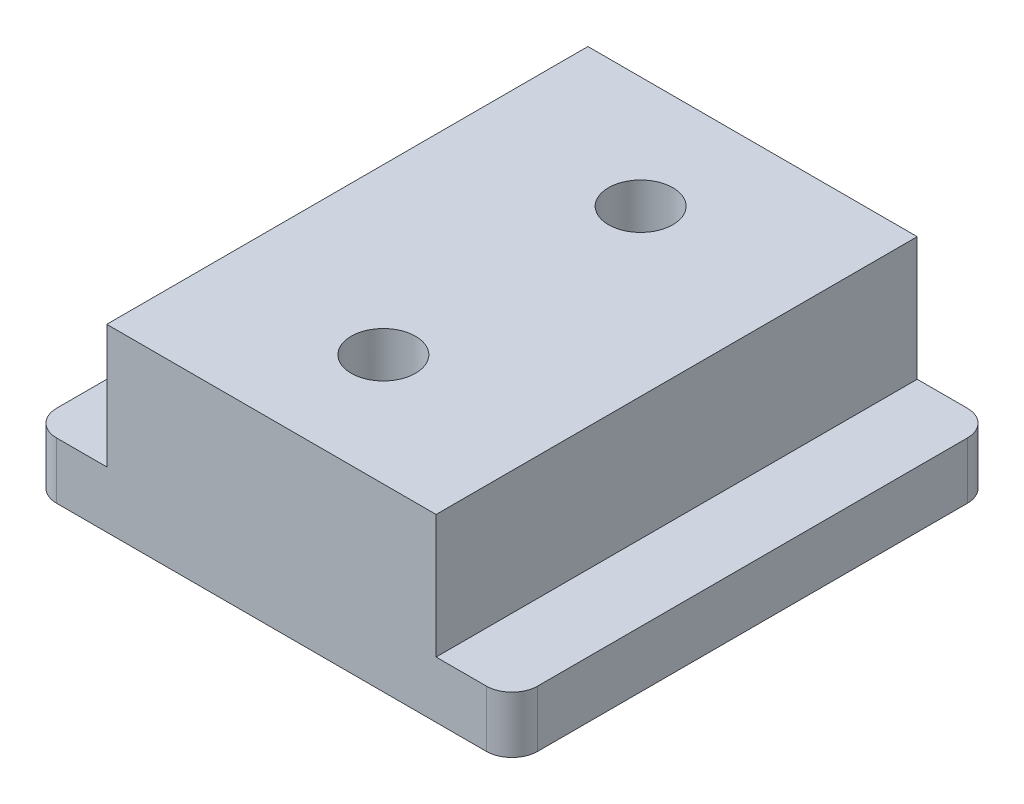
ISO-10303-21;
HEADER;
FILE_DESCRIPTION(('STEP AP214'),'2;1');
FILE_NAME('part.step','',(''),(''),'','','');
FILE_SCHEMA(('AUTOMOTIVE_DESIGN { 1 0 10303 214 1 1 1 1 }'));
ENDSEC;
DATA;
#1=APPLICATION_CONTEXT('core data for automotive mechanical design processes');
#2=APPLICATION_PROTOCOL_DEFINITION('international standard','automotive_design',2000,#1);
#3=PRODUCT_CONTEXT('',#1,'mechanical');
#4=PRODUCT('Part','Part','',(#3));
#5=PRODUCT_RELATED_PRODUCT_CATEGORY('part','',(#4));
#6=PRODUCT_DEFINITION_FORMATION('','',#4);
#7=PRODUCT_DEFINITION_CONTEXT('part definition',#1,'design');
#8=PRODUCT_DEFINITION('design','',#6,#7);
#9=PRODUCT_DEFINITION_SHAPE('','',#8);
#10=(LENGTH_UNIT() NAMED_UNIT(*) SI_UNIT(.MILLI.,.METRE.));
#11=(NAMED_UNIT(*) PLANE_ANGLE_UNIT() SI_UNIT($,.RADIAN.));
#12=(NAMED_UNIT(*) SI_UNIT($,.STERADIAN.) SOLID_ANGLE_UNIT());
#13=UNCERTAINTY_MEASURE_WITH_UNIT(LENGTH_MEASURE(1.E-05),#10,'distance_accuracy_value','');
#14=(GEOMETRIC_REPRESENTATION_CONTEXT(3) GLOBAL_UNCERTAINTY_ASSIGNED_CONTEXT((#13)) GLOBAL_UNIT_ASSIGNED_CONTEXT((#10,
#11,#12)) REPRESENTATION_CONTEXT('',''));
#15=CARTESIAN_POINT('',(0.,0.,0.));
#16=DIRECTION('',(0.,0.,1.));
#17=DIRECTION('',(1.,0.,0.));
#18=AXIS2_PLACEMENT_3D('',#15,#16,#17);
#19=CARTESIAN_POINT('',(-8.35,2.2,-8.35));
#20=DIRECTION('',(0.,-1.,0.));
#21=DIRECTION('',(0.,0.,-1.));
#22=AXIS2_PLACEMENT_3D('',#19,#20,#21);
#23=CYLINDRICAL_SURFACE('',#22,1.);
#24=CARTESIAN_POINT('',(-8.35,0.,-8.35));
#25=DIRECTION('',(0.,1.,0.));
#26=DIRECTION('',(0.,0.,1.));
#27=AXIS2_PLACEMENT_3D('',#24,#25,#26);
#28=CIRCLE('',#27,1.);
#29=CARTESIAN_POINT('',(-9.35,0.,-8.35));
#30=VERTEX_POINT('',#29);
#31=CARTESIAN_POINT('',(-8.34999999999999,0.,-9.35));
#32=VERTEX_POINT('',#31);
#33=EDGE_CURVE('E130',#30,#32,#28,.F.);
#34=ORIENTED_EDGE('',*,*,#33,.F.);
#35=DIRECTION('',(0.,-1.,0.));
#36=VECTOR('',#35,1.);
#37=CARTESIAN_POINT('',(-9.35,2.2,-8.35));
#38=LINE('',#37,#36);
#39=CARTESIAN_POINT('',(-9.35,2.2,-8.35));
#40=VERTEX_POINT('',#39);
#41=EDGE_CURVE('E86',#40,#30,#38,.T.);
#42=ORIENTED_EDGE('',*,*,#41,.F.);
#43=CARTESIAN_POINT('',(-8.35,2.2,-8.35));
#44=DIRECTION('',(0.,1.,0.));
#45=DIRECTION('',(0.,0.,1.));
#46=AXIS2_PLACEMENT_3D('',#43,#44,#45);
#47=CIRCLE('',#46,1.);
#48=CARTESIAN_POINT('',(-8.34999999999999,2.2,-9.35));
#49=VERTEX_POINT('',#48);
#50=EDGE_CURVE('E124',#40,#49,#47,.F.);
#51=ORIENTED_EDGE('',*,*,#50,.T.);
#52=DIRECTION('',(0.,-1.,0.));
#53=VECTOR('',#52,1.);
#54=CARTESIAN_POINT('',(-8.34999999999999,2.2,-9.35));
#55=LINE('',#54,#53);
#56=EDGE_CURVE('E62',#49,#32,#55,.T.);
#57=ORIENTED_EDGE('',*,*,#56,.T.);
#58=EDGE_LOOP('',(#34,#42,#51,#57));
#59=FACE_BOUND('',#58,.T.);
#60=ADVANCED_FACE('F38',(#59),#23,.T.);
#61=CARTESIAN_POINT('',(-9.35,2.2,0.));
#62=DIRECTION('',(1.,0.,0.));
#63=DIRECTION('',(0.,0.,-1.));
#64=AXIS2_PLACEMENT_3D('',#61,#62,#63);
#65=PLANE('',#64);
#66=DIRECTION('',(0.,0.,1.));
#67=VECTOR('',#66,1.);
#68=CARTESIAN_POINT('',(-9.35,0.,0.));
#69=LINE('',#68,#67);
#70=CARTESIAN_POINT('',(-9.35,0.,8.34999999999999));
#71=VERTEX_POINT('',#70);
#72=EDGE_CURVE('E226',#30,#71,#69,.T.);
#73=ORIENTED_EDGE('',*,*,#72,.T.);
#74=DIRECTION('',(0.,-1.,0.));
#75=VECTOR('',#74,1.);
#76=CARTESIAN_POINT('',(-9.35,2.2,8.34999999999999));
#77=LINE('',#76,#75);
#78=CARTESIAN_POINT('',(-9.35,2.2,8.34999999999999));
#79=VERTEX_POINT('',#78);
#80=EDGE_CURVE('E106',#79,#71,#77,.T.);
#81=ORIENTED_EDGE('',*,*,#80,.F.);
#82=DIRECTION('',(0.,0.,1.));
#83=VECTOR('',#82,1.);
#84=CARTESIAN_POINT('',(-9.35,2.2,0.));
#85=LINE('',#84,#83);
#86=EDGE_CURVE('E121',#40,#79,#85,.T.);
#87=ORIENTED_EDGE('',*,*,#86,.F.);
#88=ORIENTED_EDGE('',*,*,#41,.T.);
#89=EDGE_LOOP('',(#73,#81,#87,#88));
#90=FACE_BOUND('',#89,.T.);
#91=ADVANCED_FACE('F306',(#90),#65,.F.);
#92=CARTESIAN_POINT('',(-8.35,2.2,8.34999999999999));
#93=DIRECTION('',(0.,-1.,0.));
#94=DIRECTION('',(0.,0.,-1.));
#95=AXIS2_PLACEMENT_3D('',#92,#93,#94);
#96=CYLINDRICAL_SURFACE('',#95,1.);
#97=CARTESIAN_POINT('',(-8.35,0.,8.34999999999999));
#98=DIRECTION('',(0.,1.,0.));
#99=DIRECTION('',(0.,0.,1.));
#100=AXIS2_PLACEMENT_3D('',#97,#98,#99);
#101=CIRCLE('',#100,1.);
#102=CARTESIAN_POINT('',(-8.34999999999999,0.,9.34999999999999));
#103=VERTEX_POINT('',#102);
#104=EDGE_CURVE('E102',#103,#71,#101,.F.);
#105=ORIENTED_EDGE('',*,*,#104,.F.);
#106=DIRECTION('',(0.,-1.,0.));
#107=VECTOR('',#106,1.);
#108=CARTESIAN_POINT('',(-8.34999999999999,2.2,9.34999999999999));
#109=LINE('',#108,#107);
#110=CARTESIAN_POINT('',(-8.34999999999999,2.2,9.34999999999999));
#111=VERTEX_POINT('',#110);
#112=EDGE_CURVE('E96',#111,#103,#109,.T.);
#113=ORIENTED_EDGE('',*,*,#112,.F.);
#114=CARTESIAN_POINT('',(-8.35,2.2,8.34999999999999));
#115=DIRECTION('',(0.,1.,0.));
#116=DIRECTION('',(0.,0.,1.));
#117=AXIS2_PLACEMENT_3D('',#114,#115,#116);
#118=CIRCLE('',#117,1.);
#119=EDGE_CURVE('E100',#111,#79,#118,.F.);
#120=ORIENTED_EDGE('',*,*,#119,.T.);
#121=ORIENTED_EDGE('',*,*,#80,.T.);
#122=EDGE_LOOP('',(#105,#113,#120,#121));
#123=FACE_BOUND('',#122,.T.);
#124=ADVANCED_FACE('F98',(#123),#96,.T.);
#125=CARTESIAN_POINT('',(0.,2.2,9.34999999999999));
#126=DIRECTION('',(0.,0.,-1.));
#127=DIRECTION('',(-1.,0.,0.));
#128=AXIS2_PLACEMENT_3D('',#125,#126,#127);
#129=PLANE('',#128);
#130=DIRECTION('',(1.,0.,0.));
#131=VECTOR('',#130,1.);
#132=CARTESIAN_POINT('',(0.,0.,9.34999999999999));
#133=LINE('',#132,#131);
#134=CARTESIAN_POINT('',(8.34999999999999,0.,9.34999999999999));
#135=VERTEX_POINT('',#134);
#136=EDGE_CURVE('E224',#103,#135,#133,.T.);
#137=ORIENTED_EDGE('',*,*,#136,.T.);
#138=DIRECTION('',(0.,-1.,0.));
#139=VECTOR('',#138,1.);
#140=CARTESIAN_POINT('',(8.34999999999999,2.2,9.34999999999999));
#141=LINE('',#140,#139);
#142=CARTESIAN_POINT('',(8.34999999999999,2.2,9.34999999999999));
#143=VERTEX_POINT('',#142);
#144=EDGE_CURVE('E185',#143,#135,#141,.T.);
#145=ORIENTED_EDGE('',*,*,#144,.F.);
#146=DIRECTION('',(1.,0.,0.));
#147=VECTOR('',#146,1.);
#148=CARTESIAN_POINT('',(0.,2.2,9.34999999999999));
#149=LINE('',#148,#147);
#150=CARTESIAN_POINT('',(6.4,2.2,9.34999999999999));
#151=VERTEX_POINT('',#150);
#152=EDGE_CURVE('E188',#151,#143,#149,.T.);
#153=ORIENTED_EDGE('',*,*,#152,.F.);
#154=DIRECTION('',(0.,-1.,0.));
#155=VECTOR('',#154,1.);
#156=CARTESIAN_POINT('',(6.4,7.,9.34999999999999));
#157=LINE('',#156,#155);
#158=CARTESIAN_POINT('',(6.4,7.,9.34999999999999));
#159=VERTEX_POINT('',#158);
#160=EDGE_CURVE('E146',#159,#151,#157,.T.);
#161=ORIENTED_EDGE('',*,*,#160,.F.);
#162=DIRECTION('',(1.,0.,0.));
#163=VECTOR('',#162,1.);
#164=CARTESIAN_POINT('',(0.,7.,9.34999999999999));
#165=LINE('',#164,#163);
#166=CARTESIAN_POINT('',(-6.4,7.,9.34999999999999));
#167=VERTEX_POINT('',#166);
#168=EDGE_CURVE('E164',#167,#159,#165,.T.);
#169=ORIENTED_EDGE('',*,*,#168,.F.);
#170=DIRECTION('',(0.,-1.,0.));
#171=VECTOR('',#170,1.);
#172=CARTESIAN_POINT('',(-6.4,7.,9.34999999999999));
#173=LINE('',#172,#171);
#174=CARTESIAN_POINT('',(-6.4,2.2,9.34999999999999));
#175=VERTEX_POINT('',#174);
#176=EDGE_CURVE('E114',#167,#175,#173,.T.);
#177=ORIENTED_EDGE('',*,*,#176,.T.);
#178=DIRECTION('',(1.,0.,0.));
#179=VECTOR('',#178,1.);
#180=CARTESIAN_POINT('',(0.,2.2,9.34999999999999));
#181=LINE('',#180,#179);
#182=EDGE_CURVE('E110',#111,#175,#181,.T.);
#183=ORIENTED_EDGE('',*,*,#182,.F.);
#184=ORIENTED_EDGE('',*,*,#112,.T.);
#185=EDGE_LOOP('',(#137,#145,#153,#161,#169,#177,#183,#184));
#186=FACE_BOUND('',#185,.T.);
#187=ADVANCED_FACE('F111',(#186),#129,.F.);
#188=CARTESIAN_POINT('',(0.,2.2,-9.35));
#189=DIRECTION('',(0.,0.,-1.));
#190=DIRECTION('',(-1.,0.,0.));
#191=AXIS2_PLACEMENT_3D('',#188,#189,#190);
#192=PLANE('',#191);
#193=DIRECTION('',(1.,0.,0.));
#194=VECTOR('',#193,1.);
#195=CARTESIAN_POINT('',(0.,0.,-9.35));
#196=LINE('',#195,#194);
#197=CARTESIAN_POINT('',(8.34999999999999,0.,-9.35));
#198=VERTEX_POINT('',#197);
#199=EDGE_CURVE('E221',#32,#198,#196,.T.);
#200=ORIENTED_EDGE('',*,*,#199,.F.);
#201=ORIENTED_EDGE('',*,*,#56,.F.);
#202=DIRECTION('',(1.,0.,0.));
#203=VECTOR('',#202,1.);
#204=CARTESIAN_POINT('',(0.,2.2,-9.35));
#205=LINE('',#204,#203);
#206=CARTESIAN_POINT('',(-6.4,2.2,-9.35));
#207=VERTEX_POINT('',#206);
#208=EDGE_CURVE('E134',#49,#207,#205,.T.);
#209=ORIENTED_EDGE('',*,*,#208,.T.);
#210=DIRECTION('',(0.,-1.,0.));
#211=VECTOR('',#210,1.);
#212=CARTESIAN_POINT('',(-6.4,7.,-9.35));
#213=LINE('',#212,#211);
#214=CARTESIAN_POINT('',(-6.4,7.,-9.35));
#215=VERTEX_POINT('',#214);
#216=EDGE_CURVE('E145',#215,#207,#213,.T.);
#217=ORIENTED_EDGE('',*,*,#216,.F.);
#218=DIRECTION('',(1.,0.,0.));
#219=VECTOR('',#218,1.);
#220=CARTESIAN_POINT('',(0.,7.,-9.35));
#221=LINE('',#220,#219);
#222=CARTESIAN_POINT('',(6.4,7.,-9.35));
#223=VERTEX_POINT('',#222);
#224=EDGE_CURVE('E170',#215,#223,#221,.T.);
#225=ORIENTED_EDGE('',*,*,#224,.T.);
#226=DIRECTION('',(0.,-1.,0.));
#227=VECTOR('',#226,1.);
#228=CARTESIAN_POINT('',(6.4,7.,-9.35));
#229=LINE('',#228,#227);
#230=CARTESIAN_POINT('',(6.4,2.2,-9.35));
#231=VERTEX_POINT('',#230);
#232=EDGE_CURVE('E142',#223,#231,#229,.T.);
#233=ORIENTED_EDGE('',*,*,#232,.T.);
#234=DIRECTION('',(1.,0.,0.));
#235=VECTOR('',#234,1.);
#236=CARTESIAN_POINT('',(0.,2.2,-9.35));
#237=LINE('',#236,#235);
#238=CARTESIAN_POINT('',(8.34999999999999,2.2,-9.35));
#239=VERTEX_POINT('',#238);
#240=EDGE_CURVE('E205',#231,#239,#237,.T.);
#241=ORIENTED_EDGE('',*,*,#240,.T.);
#242=DIRECTION('',(0.,-1.,0.));
#243=VECTOR('',#242,1.);
#244=CARTESIAN_POINT('',(8.34999999999999,2.2,-9.35));
#245=LINE('',#244,#243);
#246=EDGE_CURVE('E182',#239,#198,#245,.T.);
#247=ORIENTED_EDGE('',*,*,#246,.T.);
#248=EDGE_LOOP('',(#200,#201,#209,#217,#225,#233,#241,#247));
#249=FACE_BOUND('',#248,.T.);
#250=ADVANCED_FACE('F230',(#249),#192,.T.);
#251=CARTESIAN_POINT('',(0.,2.2,0.));
#252=DIRECTION('',(0.,1.,0.));
#253=DIRECTION('',(0.,0.,1.));
#254=AXIS2_PLACEMENT_3D('',#251,#252,#253);
#255=PLANE('',#254);
#256=ORIENTED_EDGE('',*,*,#50,.F.);
#257=ORIENTED_EDGE('',*,*,#86,.T.);
#258=ORIENTED_EDGE('',*,*,#119,.F.);
#259=ORIENTED_EDGE('',*,*,#182,.T.);
#260=DIRECTION('',(0.,0.,1.));
#261=VECTOR('',#260,1.);
#262=CARTESIAN_POINT('',(-6.4,2.2,0.));
#263=LINE('',#262,#261);
#264=EDGE_CURVE('E117',#207,#175,#263,.T.);
#265=ORIENTED_EDGE('',*,*,#264,.F.);
#266=ORIENTED_EDGE('',*,*,#208,.F.);
#267=EDGE_LOOP('',(#256,#257,#258,#259,#265,#266));
#268=FACE_BOUND('',#267,.T.);
#269=ADVANCED_FACE('F120',(#268),#255,.T.);
#270=CARTESIAN_POINT('',(0.,0.,0.));
#271=DIRECTION('',(0.,1.,0.));
#272=DIRECTION('',(0.,0.,1.));
#273=AXIS2_PLACEMENT_3D('',#270,#271,#272);
#274=PLANE('',#273);
#275=CARTESIAN_POINT('',(0.,0.,-5.));
#276=DIRECTION('',(0.,1.,0.));
#277=DIRECTION('',(0.,0.,1.));
#278=AXIS2_PLACEMENT_3D('',#275,#276,#277);
#279=CIRCLE('',#278,2.5);
#280=CARTESIAN_POINT('',(0.,0.,-2.5));
#281=VERTEX_POINT('',#280);
#282=EDGE_CURVE('E288',#281,#281,#279,.T.);
#283=ORIENTED_EDGE('',*,*,#282,.T.);
#284=EDGE_LOOP('',(#283));
#285=FACE_BOUND('',#284,.T.);
#286=CARTESIAN_POINT('',(0.,0.,5.));
#287=DIRECTION('',(0.,1.,0.));
#288=DIRECTION('',(0.,0.,1.));
#289=AXIS2_PLACEMENT_3D('',#286,#287,#288);
#290=CIRCLE('',#289,2.5);
#291=CARTESIAN_POINT('',(0.,0.,7.5));
#292=VERTEX_POINT('',#291);
#293=EDGE_CURVE('E282',#292,#292,#290,.T.);
#294=ORIENTED_EDGE('',*,*,#293,.T.);
#295=EDGE_LOOP('',(#294));
#296=FACE_BOUND('',#295,.T.);
#297=ORIENTED_EDGE('',*,*,#33,.T.);
#298=ORIENTED_EDGE('',*,*,#199,.T.);
#299=CARTESIAN_POINT('',(8.35,0.,-8.35));
#300=DIRECTION('',(0.,1.,0.));
#301=DIRECTION('',(0.,0.,1.));
#302=AXIS2_PLACEMENT_3D('',#299,#300,#301);
#303=CIRCLE('',#302,1.);
#304=CARTESIAN_POINT('',(9.35,0.,-8.35));
#305=VERTEX_POINT('',#304);
#306=EDGE_CURVE('E189',#198,#305,#303,.F.);
#307=ORIENTED_EDGE('',*,*,#306,.T.);
#308=DIRECTION('',(0.,0.,1.));
#309=VECTOR('',#308,1.);
#310=CARTESIAN_POINT('',(9.35,0.,0.));
#311=LINE('',#310,#309);
#312=CARTESIAN_POINT('',(9.35,0.,8.34999999999999));
#313=VERTEX_POINT('',#312);
#314=EDGE_CURVE('E193',#305,#313,#311,.T.);
#315=ORIENTED_EDGE('',*,*,#314,.T.);
#316=CARTESIAN_POINT('',(8.35,0.,8.34999999999999));
#317=DIRECTION('',(0.,1.,0.));
#318=DIRECTION('',(0.,0.,1.));
#319=AXIS2_PLACEMENT_3D('',#316,#317,#318);
#320=CIRCLE('',#319,1.);
#321=EDGE_CURVE('E196',#313,#135,#320,.F.);
#322=ORIENTED_EDGE('',*,*,#321,.T.);
#323=ORIENTED_EDGE('',*,*,#136,.F.);
#324=ORIENTED_EDGE('',*,*,#104,.T.);
#325=ORIENTED_EDGE('',*,*,#72,.F.);
#326=EDGE_LOOP('',(#297,#298,#307,#315,#322,#323,#324,#325));
#327=FACE_BOUND('',#326,.T.);
#328=ADVANCED_FACE('F228',(#285,#296,#327),#274,.F.);
#329=CARTESIAN_POINT('',(-6.4,7.,0.));
#330=DIRECTION('',(1.,0.,0.));
#331=DIRECTION('',(0.,0.,-1.));
#332=AXIS2_PLACEMENT_3D('',#329,#330,#331);
#333=PLANE('',#332);
#334=ORIENTED_EDGE('',*,*,#216,.T.);
#335=ORIENTED_EDGE('',*,*,#264,.T.);
#336=ORIENTED_EDGE('',*,*,#176,.F.);
#337=DIRECTION('',(0.,0.,1.));
#338=VECTOR('',#337,1.);
#339=CARTESIAN_POINT('',(-6.4,7.,0.));
#340=LINE('',#339,#338);
#341=EDGE_CURVE('E167',#215,#167,#340,.T.);
#342=ORIENTED_EDGE('',*,*,#341,.F.);
#343=EDGE_LOOP('',(#334,#335,#336,#342));
#344=FACE_BOUND('',#343,.T.);
#345=ADVANCED_FACE('F321',(#344),#333,.F.);
#346=CARTESIAN_POINT('',(6.4,7.,0.));
#347=DIRECTION('',(1.,0.,0.));
#348=DIRECTION('',(0.,0.,-1.));
#349=AXIS2_PLACEMENT_3D('',#346,#347,#348);
#350=PLANE('',#349);
#351=DIRECTION('',(0.,0.,1.));
#352=VECTOR('',#351,1.);
#353=CARTESIAN_POINT('',(6.4,2.2,0.));
#354=LINE('',#353,#352);
#355=EDGE_CURVE('E53',#231,#151,#354,.T.);
#356=ORIENTED_EDGE('',*,*,#355,.F.);
#357=ORIENTED_EDGE('',*,*,#232,.F.);
#358=DIRECTION('',(0.,0.,1.));
#359=VECTOR('',#358,1.);
#360=CARTESIAN_POINT('',(6.4,7.,0.));
#361=LINE('',#360,#359);
#362=EDGE_CURVE('E173',#223,#159,#361,.T.);
#363=ORIENTED_EDGE('',*,*,#362,.T.);
#364=ORIENTED_EDGE('',*,*,#160,.T.);
#365=EDGE_LOOP('',(#356,#357,#363,#364));
#366=FACE_BOUND('',#365,.T.);
#367=ADVANCED_FACE('F269',(#366),#350,.T.);
#368=CARTESIAN_POINT('',(0.,7.,-5.));
#369=DIRECTION('',(0.,-1.,0.));
#370=DIRECTION('',(0.,0.,-1.));
#371=AXIS2_PLACEMENT_3D('',#368,#369,#370);
#372=CYLINDRICAL_SURFACE('',#371,1.25);
#373=CARTESIAN_POINT('',(0.,4.05404962177392,-5.));
#374=DIRECTION('',(0.,-1.,0.));
#375=DIRECTION('',(0.,0.,-1.));
#376=AXIS2_PLACEMENT_3D('',#373,#374,#375);
#377=CIRCLE('',#376,1.25);
#378=CARTESIAN_POINT('',(0.,4.05404962177392,-6.25));
#379=VERTEX_POINT('',#378);
#380=EDGE_CURVE('E11',#379,#379,#377,.T.);
#381=ORIENTED_EDGE('',*,*,#380,.T.);
#382=EDGE_LOOP('',(#381));
#383=FACE_BOUND('',#382,.T.);
#384=CARTESIAN_POINT('',(0.,7.,-5.));
#385=DIRECTION('',(0.,1.,0.));
#386=DIRECTION('',(0.,0.,1.));
#387=AXIS2_PLACEMENT_3D('',#384,#385,#386);
#388=CIRCLE('',#387,1.25);
#389=CARTESIAN_POINT('',(0.,7.,-3.75));
#390=VERTEX_POINT('',#389);
#391=EDGE_CURVE('E161',#390,#390,#388,.T.);
#392=ORIENTED_EDGE('',*,*,#391,.T.);
#393=EDGE_LOOP('',(#392));
#394=FACE_BOUND('',#393,.T.);
#395=ADVANCED_FACE('F327',(#383,#394),#372,.F.);
#396=CARTESIAN_POINT('',(0.,7.,5.));
#397=DIRECTION('',(0.,-1.,0.));
#398=DIRECTION('',(0.,0.,-1.));
#399=AXIS2_PLACEMENT_3D('',#396,#397,#398);
#400=CYLINDRICAL_SURFACE('',#399,1.25);
#401=CARTESIAN_POINT('',(0.,4.05404962177392,5.));
#402=DIRECTION('',(0.,-1.,0.));
#403=DIRECTION('',(0.,0.,-1.));
#404=AXIS2_PLACEMENT_3D('',#401,#402,#403);
#405=CIRCLE('',#404,1.25);
#406=CARTESIAN_POINT('',(0.,4.05404962177392,3.75));
#407=VERTEX_POINT('',#406);
#408=EDGE_CURVE('E46',#407,#407,#405,.T.);
#409=ORIENTED_EDGE('',*,*,#408,.T.);
#410=EDGE_LOOP('',(#409));
#411=FACE_BOUND('',#410,.T.);
#412=CARTESIAN_POINT('',(0.,7.,5.));
#413=DIRECTION('',(0.,1.,0.));
#414=DIRECTION('',(0.,0.,1.));
#415=AXIS2_PLACEMENT_3D('',#412,#413,#414);
#416=CIRCLE('',#415,1.25);
#417=CARTESIAN_POINT('',(0.,7.,6.25));
#418=VERTEX_POINT('',#417);
#419=EDGE_CURVE('E158',#418,#418,#416,.T.);
#420=ORIENTED_EDGE('',*,*,#419,.T.);
#421=EDGE_LOOP('',(#420));
#422=FACE_BOUND('',#421,.T.);
#423=ADVANCED_FACE('F333',(#411,#422),#400,.F.);
#424=CARTESIAN_POINT('',(0.,7.,0.));
#425=DIRECTION('',(0.,1.,0.));
#426=DIRECTION('',(0.,0.,1.));
#427=AXIS2_PLACEMENT_3D('',#424,#425,#426);
#428=PLANE('',#427);
#429=ORIENTED_EDGE('',*,*,#362,.F.);
#430=ORIENTED_EDGE('',*,*,#224,.F.);
#431=ORIENTED_EDGE('',*,*,#341,.T.);
#432=ORIENTED_EDGE('',*,*,#168,.T.);
#433=EDGE_LOOP('',(#429,#430,#431,#432));
#434=FACE_BOUND('',#433,.T.);
#435=ORIENTED_EDGE('',*,*,#391,.F.);
#436=EDGE_LOOP('',(#435));
#437=FACE_BOUND('',#436,.T.);
#438=ORIENTED_EDGE('',*,*,#419,.F.);
#439=EDGE_LOOP('',(#438));
#440=FACE_BOUND('',#439,.T.);
#441=ADVANCED_FACE('F262',(#434,#437,#440),#428,.T.);
#442=CARTESIAN_POINT('',(8.35,2.2,8.34999999999999));
#443=DIRECTION('',(0.,-1.,0.));
#444=DIRECTION('',(0.,0.,-1.));
#445=AXIS2_PLACEMENT_3D('',#442,#443,#444);
#446=CYLINDRICAL_SURFACE('',#445,1.);
#447=ORIENTED_EDGE('',*,*,#321,.F.);
#448=DIRECTION('',(0.,-1.,0.));
#449=VECTOR('',#448,1.);
#450=CARTESIAN_POINT('',(9.35,2.2,8.34999999999999));
#451=LINE('',#450,#449);
#452=CARTESIAN_POINT('',(9.35,2.2,8.34999999999999));
#453=VERTEX_POINT('',#452);
#454=EDGE_CURVE('E176',#453,#313,#451,.T.);
#455=ORIENTED_EDGE('',*,*,#454,.F.);
#456=CARTESIAN_POINT('',(8.35,2.2,8.34999999999999));
#457=DIRECTION('',(0.,1.,0.));
#458=DIRECTION('',(0.,0.,1.));
#459=AXIS2_PLACEMENT_3D('',#456,#457,#458);
#460=CIRCLE('',#459,1.);
#461=EDGE_CURVE('E192',#453,#143,#460,.F.);
#462=ORIENTED_EDGE('',*,*,#461,.T.);
#463=ORIENTED_EDGE('',*,*,#144,.T.);
#464=EDGE_LOOP('',(#447,#455,#462,#463));
#465=FACE_BOUND('',#464,.T.);
#466=ADVANCED_FACE('F339',(#465),#446,.T.);
#467=CARTESIAN_POINT('',(9.35,2.2,0.));
#468=DIRECTION('',(1.,0.,0.));
#469=DIRECTION('',(0.,0.,-1.));
#470=AXIS2_PLACEMENT_3D('',#467,#468,#469);
#471=PLANE('',#470);
#472=ORIENTED_EDGE('',*,*,#314,.F.);
#473=DIRECTION('',(0.,-1.,0.));
#474=VECTOR('',#473,1.);
#475=CARTESIAN_POINT('',(9.35,2.2,-8.35));
#476=LINE('',#475,#474);
#477=CARTESIAN_POINT('',(9.35,2.2,-8.35));
#478=VERTEX_POINT('',#477);
#479=EDGE_CURVE('E179',#478,#305,#476,.T.);
#480=ORIENTED_EDGE('',*,*,#479,.F.);
#481=DIRECTION('',(0.,0.,1.));
#482=VECTOR('',#481,1.);
#483=CARTESIAN_POINT('',(9.35,2.2,0.));
#484=LINE('',#483,#482);
#485=EDGE_CURVE('E276',#478,#453,#484,.T.);
#486=ORIENTED_EDGE('',*,*,#485,.T.);
#487=ORIENTED_EDGE('',*,*,#454,.T.);
#488=EDGE_LOOP('',(#472,#480,#486,#487));
#489=FACE_BOUND('',#488,.T.);
#490=ADVANCED_FACE('F342',(#489),#471,.T.);
#491=CARTESIAN_POINT('',(8.35,2.2,-8.35));
#492=DIRECTION('',(0.,-1.,0.));
#493=DIRECTION('',(0.,0.,-1.));
#494=AXIS2_PLACEMENT_3D('',#491,#492,#493);
#495=CYLINDRICAL_SURFACE('',#494,1.);
#496=ORIENTED_EDGE('',*,*,#306,.F.);
#497=ORIENTED_EDGE('',*,*,#246,.F.);
#498=CARTESIAN_POINT('',(8.35,2.2,-8.35));
#499=DIRECTION('',(0.,1.,0.));
#500=DIRECTION('',(0.,0.,1.));
#501=AXIS2_PLACEMENT_3D('',#498,#499,#500);
#502=CIRCLE('',#501,1.);
#503=EDGE_CURVE('E202',#239,#478,#502,.F.);
#504=ORIENTED_EDGE('',*,*,#503,.T.);
#505=ORIENTED_EDGE('',*,*,#479,.T.);
#506=EDGE_LOOP('',(#496,#497,#504,#505));
#507=FACE_BOUND('',#506,.T.);
#508=ADVANCED_FACE('F241',(#507),#495,.T.);
#509=CARTESIAN_POINT('',(0.,2.2,0.));
#510=DIRECTION('',(0.,1.,0.));
#511=DIRECTION('',(0.,0.,1.));
#512=AXIS2_PLACEMENT_3D('',#509,#510,#511);
#513=PLANE('',#512);
#514=ORIENTED_EDGE('',*,*,#461,.F.);
#515=ORIENTED_EDGE('',*,*,#485,.F.);
#516=ORIENTED_EDGE('',*,*,#503,.F.);
#517=ORIENTED_EDGE('',*,*,#240,.F.);
#518=ORIENTED_EDGE('',*,*,#355,.T.);
#519=ORIENTED_EDGE('',*,*,#152,.T.);
#520=EDGE_LOOP('',(#514,#515,#516,#517,#518,#519));
#521=FACE_BOUND('',#520,.T.);
#522=ADVANCED_FACE('F272',(#521),#513,.T.);
#523=CARTESIAN_POINT('',(0.,2.2,5.));
#524=DIRECTION('',(0.,-1.,0.));
#525=DIRECTION('',(0.,0.,-1.));
#526=AXIS2_PLACEMENT_3D('',#523,#524,#525);
#527=CYLINDRICAL_SURFACE('',#526,2.5);
#528=CARTESIAN_POINT('',(0.,2.2,5.));
#529=DIRECTION('',(0.,1.,0.));
#530=DIRECTION('',(0.,0.,1.));
#531=AXIS2_PLACEMENT_3D('',#528,#529,#530);
#532=CIRCLE('',#531,2.5);
#533=CARTESIAN_POINT('',(0.,2.2,7.5));
#534=VERTEX_POINT('',#533);
#535=EDGE_CURVE('E199',#534,#534,#532,.T.);
#536=ORIENTED_EDGE('',*,*,#535,.T.);
#537=EDGE_LOOP('',(#536));
#538=FACE_BOUND('',#537,.T.);
#539=ORIENTED_EDGE('',*,*,#293,.F.);
#540=EDGE_LOOP('',(#539));
#541=FACE_BOUND('',#540,.T.);
#542=ADVANCED_FACE('F350',(#538,#541),#527,.F.);
#543=CARTESIAN_POINT('',(0.,2.2,-5.));
#544=DIRECTION('',(0.,-1.,0.));
#545=DIRECTION('',(0.,0.,-1.));
#546=AXIS2_PLACEMENT_3D('',#543,#544,#545);
#547=CYLINDRICAL_SURFACE('',#546,2.5);
#548=CARTESIAN_POINT('',(0.,2.2,-5.));
#549=DIRECTION('',(0.,1.,0.));
#550=DIRECTION('',(0.,0.,1.));
#551=AXIS2_PLACEMENT_3D('',#548,#549,#550);
#552=CIRCLE('',#551,2.5);
#553=CARTESIAN_POINT('',(0.,2.2,-2.5));
#554=VERTEX_POINT('',#553);
#555=EDGE_CURVE('E285',#554,#554,#552,.T.);
#556=ORIENTED_EDGE('',*,*,#555,.T.);
#557=EDGE_LOOP('',(#556));
#558=FACE_BOUND('',#557,.T.);
#559=ORIENTED_EDGE('',*,*,#282,.F.);
#560=EDGE_LOOP('',(#559));
#561=FACE_BOUND('',#560,.T.);
#562=ADVANCED_FACE('F294',(#558,#561),#547,.F.);
#563=CARTESIAN_POINT('',(0.,4.05404962177392,5.));
#564=DIRECTION('',(0.,-1.,0.));
#565=DIRECTION('',(0.,0.,-1.));
#566=AXIS2_PLACEMENT_3D('',#563,#564,#565);
#567=TOROIDAL_SURFACE('',#566,3.25,2.);
#568=ORIENTED_EDGE('',*,*,#408,.F.);
#569=EDGE_LOOP('',(#568));
#570=FACE_BOUND('',#569,.T.);
#571=ORIENTED_EDGE('',*,*,#535,.F.);
#572=EDGE_LOOP('',(#571));
#573=FACE_BOUND('',#572,.T.);
#574=ADVANCED_FACE('F298',(#570,#573),#567,.T.);
#575=CARTESIAN_POINT('',(0.,4.05404962177392,-5.));
#576=DIRECTION('',(0.,-1.,0.));
#577=DIRECTION('',(0.,0.,-1.));
#578=AXIS2_PLACEMENT_3D('',#575,#576,#577);
#579=TOROIDAL_SURFACE('',#578,3.25,2.);
#580=ORIENTED_EDGE('',*,*,#380,.F.);
#581=EDGE_LOOP('',(#580));
#582=FACE_BOUND('',#581,.T.);
#583=ORIENTED_EDGE('',*,*,#555,.F.);
#584=EDGE_LOOP('',(#583));
#585=FACE_BOUND('',#584,.T.);
#586=ADVANCED_FACE('F40',(#582,#585),#579,.T.);
#587=CLOSED_SHELL('',(#60,#91,#124,#187,#250,#269,#328,#345,#367,#395,#423,#441,#466,#490,#508,
#522,#542,#562,#574,#586));
#588=MANIFOLD_SOLID_BREP('B2',#587);
#589=ADVANCED_BREP_SHAPE_REPRESENTATION('',(#18,#588),#14);
#590=SHAPE_DEFINITION_REPRESENTATION(#9,#589);
ENDSEC;
END-ISO-10303-21;
